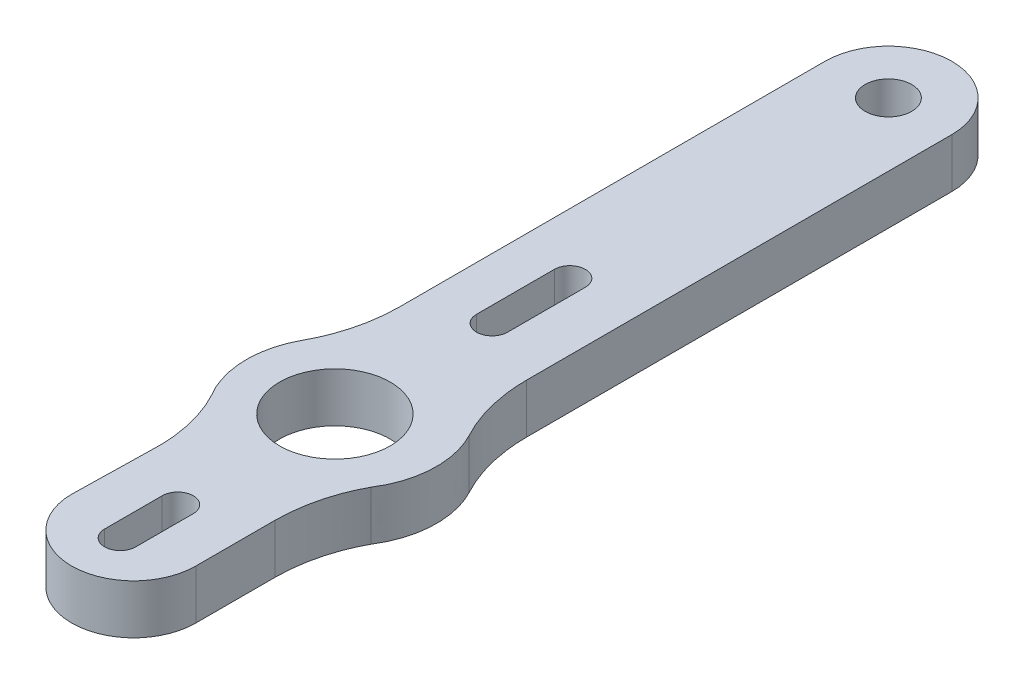
ISO-10303-21;
HEADER;
FILE_DESCRIPTION(('STEP AP214'),'2;1');
FILE_NAME('part.step','',(''),(''),'','','');
FILE_SCHEMA(('AUTOMOTIVE_DESIGN { 1 0 10303 214 1 1 1 1 }'));
ENDSEC;
DATA;
#1=APPLICATION_CONTEXT('core data for automotive mechanical design processes');
#2=APPLICATION_PROTOCOL_DEFINITION('international standard','automotive_design',2000,#1);
#3=PRODUCT_CONTEXT('',#1,'mechanical');
#4=PRODUCT('Part','Part','',(#3));
#5=PRODUCT_RELATED_PRODUCT_CATEGORY('part','',(#4));
#6=PRODUCT_DEFINITION_FORMATION('','',#4);
#7=PRODUCT_DEFINITION_CONTEXT('part definition',#1,'design');
#8=PRODUCT_DEFINITION('design','',#6,#7);
#9=PRODUCT_DEFINITION_SHAPE('','',#8);
#10=(LENGTH_UNIT() NAMED_UNIT(*) SI_UNIT(.MILLI.,.METRE.));
#11=(NAMED_UNIT(*) PLANE_ANGLE_UNIT() SI_UNIT($,.RADIAN.));
#12=(NAMED_UNIT(*) SI_UNIT($,.STERADIAN.) SOLID_ANGLE_UNIT());
#13=UNCERTAINTY_MEASURE_WITH_UNIT(LENGTH_MEASURE(1.E-05),#10,'distance_accuracy_value','');
#14=(GEOMETRIC_REPRESENTATION_CONTEXT(3) GLOBAL_UNCERTAINTY_ASSIGNED_CONTEXT((#13)) GLOBAL_UNIT_ASSIGNED_CONTEXT((#10,
#11,#12)) REPRESENTATION_CONTEXT('',''));
#15=CARTESIAN_POINT('',(0.,0.,0.));
#16=DIRECTION('',(0.,0.,1.));
#17=DIRECTION('',(1.,0.,0.));
#18=AXIS2_PLACEMENT_3D('',#15,#16,#17);
#19=CARTESIAN_POINT('',(-4.16908106055203,3.175,15.9949920017812));
#20=DIRECTION('',(0.,-1.,0.));
#21=DIRECTION('',(0.,0.,-1.));
#22=AXIS2_PLACEMENT_3D('',#19,#20,#21);
#23=PLANE('',#22);
#24=CARTESIAN_POINT('',(0.00104066737557961,3.175,10.9132962446336));
#25=DIRECTION('',(0.,1.,0.));
#26=DIRECTION('',(0.,0.,1.));
#27=AXIS2_PLACEMENT_3D('',#24,#25,#26);
#28=CIRCLE('',#27,3.556);
#29=CARTESIAN_POINT('',(0.00104066737557961,3.175,14.4692962446336));
#30=VERTEX_POINT('',#29);
#31=EDGE_CURVE('E207',#30,#30,#28,.T.);
#32=ORIENTED_EDGE('',*,*,#31,.F.);
#33=EDGE_LOOP('',(#32));
#34=FACE_BOUND('',#33,.T.);
#35=CARTESIAN_POINT('',(0.00106991381050581,3.175,0.813017652380107));
#36=DIRECTION('',(0.,1.,0.));
#37=DIRECTION('',(0.,0.,-1.));
#38=AXIS2_PLACEMENT_3D('',#35,#36,#37);
#39=CIRCLE('',#38,0.998231383477141);
#40=CARTESIAN_POINT('',(-0.997161469666635,3.175,0.813017652380107));
#41=VERTEX_POINT('',#40);
#42=CARTESIAN_POINT('',(0.999301297287647,3.175,0.813017652380107));
#43=VERTEX_POINT('',#42);
#44=EDGE_CURVE('E213',#41,#43,#39,.T.);
#45=ORIENTED_EDGE('',*,*,#44,.F.);
#46=DIRECTION('',(0.,0.,1.));
#47=VECTOR('',#46,1.);
#48=CARTESIAN_POINT('',(-0.997161469666635,3.175,-4.18720119916506));
#49=LINE('',#48,#47);
#50=CARTESIAN_POINT('',(-0.997161469666635,3.175,-4.18720119916506));
#51=VERTEX_POINT('',#50);
#52=EDGE_CURVE('E221',#51,#41,#49,.T.);
#53=ORIENTED_EDGE('',*,*,#52,.F.);
#54=CARTESIAN_POINT('',(0.00106991381050581,3.175,-4.18720119916506));
#55=DIRECTION('',(0.,1.,0.));
#56=DIRECTION('',(0.,0.,-1.));
#57=AXIS2_PLACEMENT_3D('',#54,#55,#56);
#58=CIRCLE('',#57,0.998231383477141);
#59=CARTESIAN_POINT('',(0.999301297287647,3.175,-4.18720119916506));
#60=VERTEX_POINT('',#59);
#61=EDGE_CURVE('E218',#60,#51,#58,.T.);
#62=ORIENTED_EDGE('',*,*,#61,.F.);
#63=DIRECTION('',(0.,0.,-1.));
#64=VECTOR('',#63,1.);
#65=CARTESIAN_POINT('',(0.999301297287647,3.175,0.813017652380107));
#66=LINE('',#65,#64);
#67=EDGE_CURVE('E215',#43,#60,#66,.T.);
#68=ORIENTED_EDGE('',*,*,#67,.F.);
#69=EDGE_LOOP('',(#45,#53,#62,#68));
#70=FACE_BOUND('',#69,.T.);
#71=CARTESIAN_POINT('',(-5.01632488886748,3.175,13.8183221379926));
#72=CARTESIAN_POINT('',(-4.27138671891038,3.175,15.1671684650016));
#73=CARTESIAN_POINT('',(-3.8805408597044,3.175,16.7746802356492));
#74=CARTESIAN_POINT('',(-3.8805408597044,3.175,18.3160677743046));
#75=B_SPLINE_CURVE_WITH_KNOTS('',3,(#71,#72,#73,#74),.UNSPECIFIED.,.F.,.F.,(4,4),(17.,18.),.UNSPECIFIED.);
#76=CARTESIAN_POINT('',(-5.01632488886748,3.175,13.8183221379926));
#77=VERTEX_POINT('',#76);
#78=CARTESIAN_POINT('',(-3.8805408597044,3.175,18.3160677743046));
#79=VERTEX_POINT('',#78);
#80=EDGE_CURVE('E249',#77,#79,#75,.T.);
#81=ORIENTED_EDGE('',*,*,#80,.T.);
#82=DIRECTION('',(-0.0201380543596992,0.,0.999797208821172));
#83=VECTOR('',#82,1.);
#84=CARTESIAN_POINT('',(-3.9918751177016,3.175,23.8434975052788));
#85=LINE('',#84,#83);
#86=CARTESIAN_POINT('',(-3.9918751177016,3.175,23.8434975052788));
#87=VERTEX_POINT('',#86);
#88=EDGE_CURVE('E255',#79,#87,#85,.T.);
#89=ORIENTED_EDGE('',*,*,#88,.T.);
#90=CARTESIAN_POINT('',(0.00106991313382748,3.175,23.8434975052788));
#91=DIRECTION('',(0.,1.,0.));
#92=DIRECTION('',(0.,0.,-1.));
#93=AXIS2_PLACEMENT_3D('',#90,#91,#92);
#94=CIRCLE('',#93,3.99294503083543);
#95=CARTESIAN_POINT('',(3.99401494396925,3.175,23.8434975052788));
#96=VERTEX_POINT('',#95);
#97=EDGE_CURVE('E261',#87,#96,#94,.T.);
#98=ORIENTED_EDGE('',*,*,#97,.T.);
#99=DIRECTION('',(0.,0.,-1.));
#100=VECTOR('',#99,1.);
#101=CARTESIAN_POINT('',(3.99401494396925,3.175,18.7597185620705));
#102=LINE('',#101,#100);
#103=CARTESIAN_POINT('',(3.99401494396925,3.175,18.7597185620705));
#104=VERTEX_POINT('',#103);
#105=EDGE_CURVE('E263',#96,#104,#102,.T.);
#106=ORIENTED_EDGE('',*,*,#105,.T.);
#107=CARTESIAN_POINT('',(3.99401494396925,3.175,18.7597185620705));
#108=CARTESIAN_POINT('',(3.99401494404401,3.175,17.0662909012822));
#109=CARTESIAN_POINT('',(4.42341324434701,3.175,15.3002166148642));
#110=CARTESIAN_POINT('',(5.24176274182083,3.175,13.8183221379926));
#111=B_SPLINE_CURVE_WITH_KNOTS('',3,(#107,#108,#109,#110),.UNSPECIFIED.,.F.,.F.,(4,4),(11.,12.),.UNSPECIFIED.);
#112=CARTESIAN_POINT('',(5.24176274182083,3.175,13.8183221379926));
#113=VERTEX_POINT('',#112);
#114=EDGE_CURVE('E265',#104,#113,#111,.T.);
#115=ORIENTED_EDGE('',*,*,#114,.T.);
#116=CARTESIAN_POINT('',(5.24176274182083,3.175,13.8183221379926));
#117=CARTESIAN_POINT('',(6.37392492293468,3.175,12.0533043274419));
#118=CARTESIAN_POINT('',(6.5298845256268,3.175,9.76643510192553));
#119=CARTESIAN_POINT('',(5.52292472318315,3.175,7.81618794224595));
#120=B_SPLINE_CURVE_WITH_KNOTS('',3,(#116,#117,#118,#119),.UNSPECIFIED.,.F.,.F.,(4,4),(9.,10.),.UNSPECIFIED.);
#121=CARTESIAN_POINT('',(5.52292472318315,3.175,7.81618794224595));
#122=VERTEX_POINT('',#121);
#123=EDGE_CURVE('E270',#113,#122,#120,.T.);
#124=ORIENTED_EDGE('',*,*,#123,.T.);
#125=CARTESIAN_POINT('',(5.52292472318315,3.175,7.81618794224595));
#126=CARTESIAN_POINT('',(4.70457522584158,3.175,6.33422998434839));
#127=CARTESIAN_POINT('',(4.27517692569758,3.175,4.56821917884142));
#128=CARTESIAN_POINT('',(4.27517692577307,3.175,2.8747280371003));
#129=B_SPLINE_CURVE_WITH_KNOTS('',3,(#125,#126,#127,#128),.UNSPECIFIED.,.F.,.F.,(4,4),(8.,9.),.UNSPECIFIED.);
#130=CARTESIAN_POINT('',(4.27517692577307,3.175,2.8747280371003));
#131=VERTEX_POINT('',#130);
#132=EDGE_CURVE('E469',#122,#131,#129,.T.);
#133=ORIENTED_EDGE('',*,*,#132,.T.);
#134=DIRECTION('',(0.,0.,-1.));
#135=VECTOR('',#134,1.);
#136=CARTESIAN_POINT('',(4.27517692577307,3.175,-24.4794195778738));
#137=LINE('',#136,#135);
#138=CARTESIAN_POINT('',(4.27517692577307,3.175,-24.4794195778738));
#139=VERTEX_POINT('',#138);
#140=EDGE_CURVE('E464',#131,#139,#137,.T.);
#141=ORIENTED_EDGE('',*,*,#140,.T.);
#142=CARTESIAN_POINT('',(0.197318033034327,3.175,-24.4630373756859));
#143=DIRECTION('',(0.,1.,0.));
#144=DIRECTION('',(0.,0.,1.));
#145=AXIS2_PLACEMENT_3D('',#142,#143,#144);
#146=CIRCLE('',#145,4.07789179915761);
#147=CARTESIAN_POINT('',(-3.88054085970441,3.175,-24.4466551734979));
#148=VERTEX_POINT('',#147);
#149=EDGE_CURVE('E460',#139,#148,#146,.T.);
#150=ORIENTED_EDGE('',*,*,#149,.T.);
#151=DIRECTION('',(0.,0.,1.));
#152=VECTOR('',#151,1.);
#153=CARTESIAN_POINT('',(-3.88054085970441,3.175,-24.4466551734979));
#154=LINE('',#153,#152);
#155=CARTESIAN_POINT('',(-3.88054085970441,3.175,2.87423818270168));
#156=VERTEX_POINT('',#155);
#157=EDGE_CURVE('E451',#148,#156,#154,.T.);
#158=ORIENTED_EDGE('',*,*,#157,.T.);
#159=CARTESIAN_POINT('',(-3.88054085970441,3.175,2.87423818270168));
#160=CARTESIAN_POINT('',(-3.87987552925061,3.175,4.56772919374628));
#161=CARTESIAN_POINT('',(-4.30857997471308,3.175,6.33390856282873));
#162=CARTESIAN_POINT('',(-5.12641542509204,3.175,7.81618794224595));
#163=B_SPLINE_CURVE_WITH_KNOTS('',3,(#159,#160,#161,#162),.UNSPECIFIED.,.F.,.F.,(4,4),(2.,3.),.UNSPECIFIED.);
#164=CARTESIAN_POINT('',(-5.12641542509204,3.175,7.81618794224595));
#165=VERTEX_POINT('',#164);
#166=EDGE_CURVE('E329',#156,#165,#163,.T.);
#167=ORIENTED_EDGE('',*,*,#166,.T.);
#168=CARTESIAN_POINT('',(-5.12641542509204,3.175,7.81618794224595));
#169=CARTESIAN_POINT('',(-6.18649366447637,3.175,9.73551085026569));
#170=CARTESIAN_POINT('',(-6.09564359098047,3.175,12.0230732710247));
#171=CARTESIAN_POINT('',(-5.01632488886748,3.175,13.8183221379926));
#172=B_SPLINE_CURVE_WITH_KNOTS('',3,(#168,#169,#170,#171),.UNSPECIFIED.,.F.,.F.,(4,4),
(1.00565880697643,2.),.UNSPECIFIED.);
#173=EDGE_CURVE('E323',#165,#77,#172,.T.);
#174=ORIENTED_EDGE('',*,*,#173,.T.);
#175=EDGE_LOOP('',(#81,#89,#98,#106,#115,#124,#133,#141,#150,#158,#167,#174));
#176=FACE_BOUND('',#175,.T.);
#177=CARTESIAN_POINT('',(0.197318033034327,3.175,-24.4630373756859));
#178=DIRECTION('',(0.,1.,0.));
#179=DIRECTION('',(0.,0.,1.));
#180=AXIS2_PLACEMENT_3D('',#177,#178,#179);
#181=CIRCLE('',#180,1.4986);
#182=CARTESIAN_POINT('',(0.197318033034327,3.175,-22.9644373756859));
#183=VERTEX_POINT('',#182);
#184=EDGE_CURVE('E244',#183,#183,#181,.T.);
#185=ORIENTED_EDGE('',*,*,#184,.F.);
#186=EDGE_LOOP('',(#185));
#187=FACE_BOUND('',#186,.T.);
#188=CARTESIAN_POINT('',(0.00106991253301218,3.175,24.7136744780451));
#189=DIRECTION('',(0.,1.,0.));
#190=DIRECTION('',(0.,0.,1.));
#191=AXIS2_PLACEMENT_3D('',#188,#189,#190);
#192=CIRCLE('',#191,0.998231383459032);
#193=CARTESIAN_POINT('',(-0.99716147092602,3.175,24.7136744780451));
#194=VERTEX_POINT('',#193);
#195=CARTESIAN_POINT('',(0.999301295992044,3.175,24.7136744780451));
#196=VERTEX_POINT('',#195);
#197=EDGE_CURVE('E171',#194,#196,#192,.T.);
#198=ORIENTED_EDGE('',*,*,#197,.F.);
#199=DIRECTION('',(0.,0.,1.));
#200=VECTOR('',#199,1.);
#201=CARTESIAN_POINT('',(-0.99716147092602,3.175,24.7136744780451));
#202=LINE('',#201,#200);
#203=CARTESIAN_POINT('',(-0.99716147092602,3.175,21.013579720048));
#204=VERTEX_POINT('',#203);
#205=EDGE_CURVE('E193',#204,#194,#202,.T.);
#206=ORIENTED_EDGE('',*,*,#205,.F.);
#207=CARTESIAN_POINT('',(0.00106991253301207,3.175,21.013579720048));
#208=DIRECTION('',(0.,1.,0.));
#209=DIRECTION('',(0.,0.,-1.));
#210=AXIS2_PLACEMENT_3D('',#207,#208,#209);
#211=CIRCLE('',#210,0.998231383459032);
#212=CARTESIAN_POINT('',(0.999301295992044,3.175,21.013579720048));
#213=VERTEX_POINT('',#212);
#214=EDGE_CURVE('E191',#213,#204,#211,.T.);
#215=ORIENTED_EDGE('',*,*,#214,.F.);
#216=DIRECTION('',(0.,0.,-1.));
#217=VECTOR('',#216,1.);
#218=CARTESIAN_POINT('',(0.999301295992044,3.175,24.7136744780451));
#219=LINE('',#218,#217);
#220=EDGE_CURVE('E179',#196,#213,#219,.T.);
#221=ORIENTED_EDGE('',*,*,#220,.F.);
#222=EDGE_LOOP('',(#198,#206,#215,#221));
#223=FACE_BOUND('',#222,.T.);
#224=ADVANCED_FACE('F33',(#34,#70,#176,#187,#223),#23,.F.);
#225=CARTESIAN_POINT('',(-4.16908106055203,0.,15.9949920017812));
#226=DIRECTION('',(0.,-1.,0.));
#227=DIRECTION('',(0.,0.,-1.));
#228=AXIS2_PLACEMENT_3D('',#225,#226,#227);
#229=PLANE('',#228);
#230=DIRECTION('',(0.,0.,1.));
#231=VECTOR('',#230,1.);
#232=CARTESIAN_POINT('',(-0.997161469666635,0.,-4.18720119916506));
#233=LINE('',#232,#231);
#234=CARTESIAN_POINT('',(-0.997161469666635,0.,-4.18720119916506));
#235=VERTEX_POINT('',#234);
#236=CARTESIAN_POINT('',(-0.997161469666635,0.,0.813017652380107));
#237=VERTEX_POINT('',#236);
#238=EDGE_CURVE('E216',#235,#237,#233,.T.);
#239=ORIENTED_EDGE('',*,*,#238,.T.);
#240=CARTESIAN_POINT('',(0.00106991381050581,0.,0.813017652380107));
#241=DIRECTION('',(0.,1.,0.));
#242=DIRECTION('',(0.,0.,-1.));
#243=AXIS2_PLACEMENT_3D('',#240,#241,#242);
#244=CIRCLE('',#243,0.998231383477141);
#245=CARTESIAN_POINT('',(0.999301297287647,0.,0.813017652380107));
#246=VERTEX_POINT('',#245);
#247=EDGE_CURVE('E210',#237,#246,#244,.T.);
#248=ORIENTED_EDGE('',*,*,#247,.T.);
#249=DIRECTION('',(0.,0.,-1.));
#250=VECTOR('',#249,1.);
#251=CARTESIAN_POINT('',(0.999301297287647,0.,0.813017652380107));
#252=LINE('',#251,#250);
#253=CARTESIAN_POINT('',(0.999301297287647,0.,-4.18720119916506));
#254=VERTEX_POINT('',#253);
#255=EDGE_CURVE('E226',#246,#254,#252,.T.);
#256=ORIENTED_EDGE('',*,*,#255,.T.);
#257=CARTESIAN_POINT('',(0.00106991381050581,0.,-4.18720119916506));
#258=DIRECTION('',(0.,1.,0.));
#259=DIRECTION('',(0.,0.,-1.));
#260=AXIS2_PLACEMENT_3D('',#257,#258,#259);
#261=CIRCLE('',#260,0.998231383477141);
#262=EDGE_CURVE('E229',#254,#235,#261,.T.);
#263=ORIENTED_EDGE('',*,*,#262,.T.);
#264=EDGE_LOOP('',(#239,#248,#256,#263));
#265=FACE_BOUND('',#264,.T.);
#266=CARTESIAN_POINT('',(0.197318033034327,0.,-24.4630373756859));
#267=DIRECTION('',(0.,1.,0.));
#268=DIRECTION('',(0.,0.,1.));
#269=AXIS2_PLACEMENT_3D('',#266,#267,#268);
#270=CIRCLE('',#269,1.4986);
#271=CARTESIAN_POINT('',(0.197318033034327,0.,-22.9644373756859));
#272=VERTEX_POINT('',#271);
#273=EDGE_CURVE('E243',#272,#272,#270,.T.);
#274=ORIENTED_EDGE('',*,*,#273,.T.);
#275=EDGE_LOOP('',(#274));
#276=FACE_BOUND('',#275,.T.);
#277=CARTESIAN_POINT('',(-5.01632488886748,0.,13.8183221379926));
#278=CARTESIAN_POINT('',(-4.27138671891038,0.,15.1671684650016));
#279=CARTESIAN_POINT('',(-3.8805408597044,0.,16.7746802356492));
#280=CARTESIAN_POINT('',(-3.8805408597044,0.,18.3160677743046));
#281=B_SPLINE_CURVE_WITH_KNOTS('',3,(#277,#278,#279,#280),.UNSPECIFIED.,.F.,.F.,(4,4),(17.,18.),.UNSPECIFIED.);
#282=CARTESIAN_POINT('',(-5.01632488886748,0.,13.8183221379926));
#283=VERTEX_POINT('',#282);
#284=CARTESIAN_POINT('',(-3.8805408597044,0.,18.3160677743046));
#285=VERTEX_POINT('',#284);
#286=EDGE_CURVE('E247',#283,#285,#281,.T.);
#287=ORIENTED_EDGE('',*,*,#286,.F.);
#288=CARTESIAN_POINT('',(-5.12641542509204,0.,7.81618794224595));
#289=CARTESIAN_POINT('',(-6.18649366447637,0.,9.73551085026569));
#290=CARTESIAN_POINT('',(-6.09564359098047,0.,12.0230732710247));
#291=CARTESIAN_POINT('',(-5.01632488886748,0.,13.8183221379926));
#292=B_SPLINE_CURVE_WITH_KNOTS('',3,(#288,#289,#290,#291),.UNSPECIFIED.,.F.,.F.,(4,4),
(1.00565880697643,2.),.UNSPECIFIED.);
#293=CARTESIAN_POINT('',(-5.12641542509204,0.,7.81618794224595));
#294=VERTEX_POINT('',#293);
#295=EDGE_CURVE('E256',#294,#283,#292,.T.);
#296=ORIENTED_EDGE('',*,*,#295,.F.);
#297=CARTESIAN_POINT('',(-3.88054085970441,0.,2.87423818270168));
#298=CARTESIAN_POINT('',(-3.87987552925061,0.,4.56772919374628));
#299=CARTESIAN_POINT('',(-4.30857997471308,0.,6.33390856282873));
#300=CARTESIAN_POINT('',(-5.12641542509204,0.,7.81618794224595));
#301=B_SPLINE_CURVE_WITH_KNOTS('',3,(#297,#298,#299,#300),.UNSPECIFIED.,.F.,.F.,(4,4),(2.,3.),.UNSPECIFIED.);
#302=CARTESIAN_POINT('',(-3.88054085970441,0.,2.87423818270168));
#303=VERTEX_POINT('',#302);
#304=EDGE_CURVE('E377',#303,#294,#301,.T.);
#305=ORIENTED_EDGE('',*,*,#304,.F.);
#306=DIRECTION('',(0.,0.,1.));
#307=VECTOR('',#306,1.);
#308=CARTESIAN_POINT('',(-3.88054085970441,0.,-24.4466551734979));
#309=LINE('',#308,#307);
#310=CARTESIAN_POINT('',(-3.88054085970441,0.,-24.4466551734979));
#311=VERTEX_POINT('',#310);
#312=EDGE_CURVE('E375',#311,#303,#309,.T.);
#313=ORIENTED_EDGE('',*,*,#312,.F.);
#314=CARTESIAN_POINT('',(0.197318033034327,0.,-24.4630373756859));
#315=DIRECTION('',(0.,1.,0.));
#316=DIRECTION('',(0.,0.,1.));
#317=AXIS2_PLACEMENT_3D('',#314,#315,#316);
#318=CIRCLE('',#317,4.07789179915761);
#319=CARTESIAN_POINT('',(4.27517692577307,0.,-24.4794195778738));
#320=VERTEX_POINT('',#319);
#321=EDGE_CURVE('E373',#320,#311,#318,.T.);
#322=ORIENTED_EDGE('',*,*,#321,.F.);
#323=DIRECTION('',(0.,0.,-1.));
#324=VECTOR('',#323,1.);
#325=CARTESIAN_POINT('',(4.27517692577307,0.,-24.4794195778738));
#326=LINE('',#325,#324);
#327=CARTESIAN_POINT('',(4.27517692577307,0.,2.8747280371003));
#328=VERTEX_POINT('',#327);
#329=EDGE_CURVE('E368',#328,#320,#326,.T.);
#330=ORIENTED_EDGE('',*,*,#329,.F.);
#331=CARTESIAN_POINT('',(5.52292472318315,0.,7.81618794224595));
#332=CARTESIAN_POINT('',(4.70457522584158,0.,6.33422998434839));
#333=CARTESIAN_POINT('',(4.27517692569758,0.,4.56821917884142));
#334=CARTESIAN_POINT('',(4.27517692577307,0.,2.8747280371003));
#335=B_SPLINE_CURVE_WITH_KNOTS('',3,(#331,#332,#333,#334),.UNSPECIFIED.,.F.,.F.,(4,4),(8.,9.),.UNSPECIFIED.);
#336=CARTESIAN_POINT('',(5.52292472318315,0.,7.81618794224595));
#337=VERTEX_POINT('',#336);
#338=EDGE_CURVE('E361',#337,#328,#335,.T.);
#339=ORIENTED_EDGE('',*,*,#338,.F.);
#340=CARTESIAN_POINT('',(5.24176274182083,0.,13.8183221379926));
#341=CARTESIAN_POINT('',(6.37392492293468,0.,12.0533043274419));
#342=CARTESIAN_POINT('',(6.5298845256268,0.,9.76643510192553));
#343=CARTESIAN_POINT('',(5.52292472318315,0.,7.81618794224595));
#344=B_SPLINE_CURVE_WITH_KNOTS('',3,(#340,#341,#342,#343),.UNSPECIFIED.,.F.,.F.,(4,4),(9.,10.),.UNSPECIFIED.);
#345=CARTESIAN_POINT('',(5.24176274182083,0.,13.8183221379926));
#346=VERTEX_POINT('',#345);
#347=EDGE_CURVE('E354',#346,#337,#344,.T.);
#348=ORIENTED_EDGE('',*,*,#347,.F.);
#349=CARTESIAN_POINT('',(3.99401494396925,0.,18.7597185620705));
#350=CARTESIAN_POINT('',(3.99401494404401,0.,17.0662909012822));
#351=CARTESIAN_POINT('',(4.42341324434701,0.,15.3002166148642));
#352=CARTESIAN_POINT('',(5.24176274182083,0.,13.8183221379926));
#353=B_SPLINE_CURVE_WITH_KNOTS('',3,(#349,#350,#351,#352),.UNSPECIFIED.,.F.,.F.,(4,4),(11.,12.),.UNSPECIFIED.);
#354=CARTESIAN_POINT('',(3.99401494396925,0.,18.7597185620705));
#355=VERTEX_POINT('',#354);
#356=EDGE_CURVE('E350',#355,#346,#353,.T.);
#357=ORIENTED_EDGE('',*,*,#356,.F.);
#358=DIRECTION('',(0.,0.,-1.));
#359=VECTOR('',#358,1.);
#360=CARTESIAN_POINT('',(3.99401494396925,0.,18.7597185620705));
#361=LINE('',#360,#359);
#362=CARTESIAN_POINT('',(3.99401494396925,0.,23.8434975052788));
#363=VERTEX_POINT('',#362);
#364=EDGE_CURVE('E348',#363,#355,#361,.T.);
#365=ORIENTED_EDGE('',*,*,#364,.F.);
#366=CARTESIAN_POINT('',(0.00106991313382748,0.,23.8434975052788));
#367=DIRECTION('',(0.,1.,0.));
#368=DIRECTION('',(0.,0.,-1.));
#369=AXIS2_PLACEMENT_3D('',#366,#367,#368);
#370=CIRCLE('',#369,3.99294503083543);
#371=CARTESIAN_POINT('',(-3.9918751177016,0.,23.8434975052788));
#372=VERTEX_POINT('',#371);
#373=EDGE_CURVE('E346',#372,#363,#370,.T.);
#374=ORIENTED_EDGE('',*,*,#373,.F.);
#375=DIRECTION('',(-0.0201380543596992,0.,0.999797208821172));
#376=VECTOR('',#375,1.);
#377=CARTESIAN_POINT('',(-3.9918751177016,0.,23.8434975052788));
#378=LINE('',#377,#376);
#379=EDGE_CURVE('E341',#285,#372,#378,.T.);
#380=ORIENTED_EDGE('',*,*,#379,.F.);
#381=EDGE_LOOP('',(#287,#296,#305,#313,#322,#330,#339,#348,#357,#365,#374,#380));
#382=FACE_BOUND('',#381,.T.);
#383=CARTESIAN_POINT('',(0.00104066737557961,0.,10.9132962446336));
#384=DIRECTION('',(0.,1.,0.));
#385=DIRECTION('',(0.,0.,1.));
#386=AXIS2_PLACEMENT_3D('',#383,#384,#385);
#387=CIRCLE('',#386,3.556);
#388=CARTESIAN_POINT('',(0.00104066737557961,0.,14.4692962446336));
#389=VERTEX_POINT('',#388);
#390=EDGE_CURVE('E187',#389,#389,#387,.T.);
#391=ORIENTED_EDGE('',*,*,#390,.T.);
#392=EDGE_LOOP('',(#391));
#393=FACE_BOUND('',#392,.T.);
#394=DIRECTION('',(0.,0.,1.));
#395=VECTOR('',#394,1.);
#396=CARTESIAN_POINT('',(-0.99716147092602,0.,24.7136744780451));
#397=LINE('',#396,#395);
#398=CARTESIAN_POINT('',(-0.99716147092602,0.,21.013579720048));
#399=VERTEX_POINT('',#398);
#400=CARTESIAN_POINT('',(-0.99716147092602,0.,24.7136744780451));
#401=VERTEX_POINT('',#400);
#402=EDGE_CURVE('E180',#399,#401,#397,.T.);
#403=ORIENTED_EDGE('',*,*,#402,.T.);
#404=CARTESIAN_POINT('',(0.00106991253301218,0.,24.7136744780451));
#405=DIRECTION('',(0.,1.,0.));
#406=DIRECTION('',(0.,0.,1.));
#407=AXIS2_PLACEMENT_3D('',#404,#405,#406);
#408=CIRCLE('',#407,0.998231383459032);
#409=CARTESIAN_POINT('',(0.999301295992044,0.,24.7136744780451));
#410=VERTEX_POINT('',#409);
#411=EDGE_CURVE('E57',#401,#410,#408,.T.);
#412=ORIENTED_EDGE('',*,*,#411,.T.);
#413=DIRECTION('',(0.,0.,-1.));
#414=VECTOR('',#413,1.);
#415=CARTESIAN_POINT('',(0.999301295992044,0.,24.7136744780451));
#416=LINE('',#415,#414);
#417=CARTESIAN_POINT('',(0.999301295992044,0.,21.013579720048));
#418=VERTEX_POINT('',#417);
#419=EDGE_CURVE('E186',#410,#418,#416,.T.);
#420=ORIENTED_EDGE('',*,*,#419,.T.);
#421=CARTESIAN_POINT('',(0.00106991253301207,0.,21.013579720048));
#422=DIRECTION('',(0.,1.,0.));
#423=DIRECTION('',(0.,0.,-1.));
#424=AXIS2_PLACEMENT_3D('',#421,#422,#423);
#425=CIRCLE('',#424,0.998231383459032);
#426=EDGE_CURVE('E199',#418,#399,#425,.T.);
#427=ORIENTED_EDGE('',*,*,#426,.T.);
#428=EDGE_LOOP('',(#403,#412,#420,#427));
#429=FACE_BOUND('',#428,.T.);
#430=ADVANCED_FACE('F299',(#265,#276,#382,#393,#429),#229,.T.);
#431=DIRECTION('',(0.,-1.,0.));
#432=VECTOR('',#431,1.);
#433=SURFACE_OF_LINEAR_EXTRUSION('',#75,#432);
#434=ORIENTED_EDGE('',*,*,#286,.T.);
#435=DIRECTION('',(0.,-1.,0.));
#436=VECTOR('',#435,1.);
#437=CARTESIAN_POINT('',(-3.8805408597044,3.175,18.3160677743046));
#438=LINE('',#437,#436);
#439=EDGE_CURVE('E11',#79,#285,#438,.T.);
#440=ORIENTED_EDGE('',*,*,#439,.F.);
#441=ORIENTED_EDGE('',*,*,#80,.F.);
#442=DIRECTION('',(0.,-1.,0.));
#443=VECTOR('',#442,1.);
#444=CARTESIAN_POINT('',(-5.01632488886748,3.175,13.8183221379926));
#445=LINE('',#444,#443);
#446=EDGE_CURVE('E328',#77,#283,#445,.T.);
#447=ORIENTED_EDGE('',*,*,#446,.T.);
#448=EDGE_LOOP('',(#434,#440,#441,#447));
#449=FACE_BOUND('',#448,.T.);
#450=ADVANCED_FACE('F35',(#449),#433,.F.);
#451=CARTESIAN_POINT('',(-3.9918751177016,3.175,23.8434975052788));
#452=DIRECTION('',(0.999797208821172,0.,0.0201380543596992));
#453=DIRECTION('',(0.0201380543596992,0.,-0.999797208821172));
#454=AXIS2_PLACEMENT_3D('',#451,#452,#453);
#455=PLANE('',#454);
#456=ORIENTED_EDGE('',*,*,#379,.T.);
#457=DIRECTION('',(0.,-1.,0.));
#458=VECTOR('',#457,1.);
#459=CARTESIAN_POINT('',(-3.9918751177016,3.175,23.8434975052788));
#460=LINE('',#459,#458);
#461=EDGE_CURVE('E42',#87,#372,#460,.T.);
#462=ORIENTED_EDGE('',*,*,#461,.F.);
#463=ORIENTED_EDGE('',*,*,#88,.F.);
#464=ORIENTED_EDGE('',*,*,#439,.T.);
#465=EDGE_LOOP('',(#456,#462,#463,#464));
#466=FACE_BOUND('',#465,.T.);
#467=ADVANCED_FACE('F292',(#466),#455,.F.);
#468=CARTESIAN_POINT('',(0.00106991313382748,3.175,23.8434975052788));
#469=DIRECTION('',(0.,-1.,0.));
#470=DIRECTION('',(0.,0.,-1.));
#471=AXIS2_PLACEMENT_3D('',#468,#469,#470);
#472=CYLINDRICAL_SURFACE('',#471,3.99294503083543);
#473=ORIENTED_EDGE('',*,*,#373,.T.);
#474=DIRECTION('',(0.,-1.,0.));
#475=VECTOR('',#474,1.);
#476=CARTESIAN_POINT('',(3.99401494396925,3.175,23.8434975052788));
#477=LINE('',#476,#475);
#478=EDGE_CURVE('E416',#96,#363,#477,.T.);
#479=ORIENTED_EDGE('',*,*,#478,.F.);
#480=ORIENTED_EDGE('',*,*,#97,.F.);
#481=ORIENTED_EDGE('',*,*,#461,.T.);
#482=EDGE_LOOP('',(#473,#479,#480,#481));
#483=FACE_BOUND('',#482,.T.);
#484=ADVANCED_FACE('F289',(#483),#472,.T.);
#485=CARTESIAN_POINT('',(3.99401494396925,3.175,18.7597185620705));
#486=DIRECTION('',(-1.,0.,0.));
#487=DIRECTION('',(0.,0.,1.));
#488=AXIS2_PLACEMENT_3D('',#485,#486,#487);
#489=PLANE('',#488);
#490=ORIENTED_EDGE('',*,*,#364,.T.);
#491=DIRECTION('',(0.,-1.,0.));
#492=VECTOR('',#491,1.);
#493=CARTESIAN_POINT('',(3.99401494396925,3.175,18.7597185620705));
#494=LINE('',#493,#492);
#495=EDGE_CURVE('E413',#104,#355,#494,.T.);
#496=ORIENTED_EDGE('',*,*,#495,.F.);
#497=ORIENTED_EDGE('',*,*,#105,.F.);
#498=ORIENTED_EDGE('',*,*,#478,.T.);
#499=EDGE_LOOP('',(#490,#496,#497,#498));
#500=FACE_BOUND('',#499,.T.);
#501=ADVANCED_FACE('F284',(#500),#489,.F.);
#502=DIRECTION('',(0.,-1.,0.));
#503=VECTOR('',#502,1.);
#504=SURFACE_OF_LINEAR_EXTRUSION('',#111,#503);
#505=ORIENTED_EDGE('',*,*,#356,.T.);
#506=DIRECTION('',(0.,-1.,0.));
#507=VECTOR('',#506,1.);
#508=CARTESIAN_POINT('',(5.24176274182083,3.175,13.8183221379926));
#509=LINE('',#508,#507);
#510=EDGE_CURVE('E410',#113,#346,#509,.T.);
#511=ORIENTED_EDGE('',*,*,#510,.F.);
#512=ORIENTED_EDGE('',*,*,#114,.F.);
#513=ORIENTED_EDGE('',*,*,#495,.T.);
#514=EDGE_LOOP('',(#505,#511,#512,#513));
#515=FACE_BOUND('',#514,.T.);
#516=ADVANCED_FACE('F279',(#515),#504,.F.);
#517=DIRECTION('',(0.,-1.,0.));
#518=VECTOR('',#517,1.);
#519=SURFACE_OF_LINEAR_EXTRUSION('',#120,#518);
#520=ORIENTED_EDGE('',*,*,#347,.T.);
#521=DIRECTION('',(0.,-1.,0.));
#522=VECTOR('',#521,1.);
#523=CARTESIAN_POINT('',(5.52292472318315,3.175,7.81618794224595));
#524=LINE('',#523,#522);
#525=EDGE_CURVE('E407',#122,#337,#524,.T.);
#526=ORIENTED_EDGE('',*,*,#525,.F.);
#527=ORIENTED_EDGE('',*,*,#123,.F.);
#528=ORIENTED_EDGE('',*,*,#510,.T.);
#529=EDGE_LOOP('',(#520,#526,#527,#528));
#530=FACE_BOUND('',#529,.T.);
#531=ADVANCED_FACE('F283',(#530),#519,.F.);
#532=DIRECTION('',(0.,-1.,0.));
#533=VECTOR('',#532,1.);
#534=SURFACE_OF_LINEAR_EXTRUSION('',#129,#533);
#535=ORIENTED_EDGE('',*,*,#338,.T.);
#536=DIRECTION('',(0.,-1.,0.));
#537=VECTOR('',#536,1.);
#538=CARTESIAN_POINT('',(4.27517692577307,3.175,2.8747280371003));
#539=LINE('',#538,#537);
#540=EDGE_CURVE('E404',#131,#328,#539,.T.);
#541=ORIENTED_EDGE('',*,*,#540,.F.);
#542=ORIENTED_EDGE('',*,*,#132,.F.);
#543=ORIENTED_EDGE('',*,*,#525,.T.);
#544=EDGE_LOOP('',(#535,#541,#542,#543));
#545=FACE_BOUND('',#544,.T.);
#546=ADVANCED_FACE('F468',(#545),#534,.F.);
#547=CARTESIAN_POINT('',(4.27517692577307,3.175,-24.4794195778738));
#548=DIRECTION('',(-1.,0.,0.));
#549=DIRECTION('',(0.,0.,1.));
#550=AXIS2_PLACEMENT_3D('',#547,#548,#549);
#551=PLANE('',#550);
#552=ORIENTED_EDGE('',*,*,#329,.T.);
#553=DIRECTION('',(0.,-1.,0.));
#554=VECTOR('',#553,1.);
#555=CARTESIAN_POINT('',(4.27517692577307,3.175,-24.4794195778738));
#556=LINE('',#555,#554);
#557=EDGE_CURVE('E401',#139,#320,#556,.T.);
#558=ORIENTED_EDGE('',*,*,#557,.F.);
#559=ORIENTED_EDGE('',*,*,#140,.F.);
#560=ORIENTED_EDGE('',*,*,#540,.T.);
#561=EDGE_LOOP('',(#552,#558,#559,#560));
#562=FACE_BOUND('',#561,.T.);
#563=ADVANCED_FACE('F463',(#562),#551,.F.);
#564=CARTESIAN_POINT('',(0.197318033034327,3.175,-24.4630373756859));
#565=DIRECTION('',(0.,-1.,0.));
#566=DIRECTION('',(0.,0.,-1.));
#567=AXIS2_PLACEMENT_3D('',#564,#565,#566);
#568=CYLINDRICAL_SURFACE('',#567,4.07789179915761);
#569=ORIENTED_EDGE('',*,*,#321,.T.);
#570=DIRECTION('',(0.,-1.,0.));
#571=VECTOR('',#570,1.);
#572=CARTESIAN_POINT('',(-3.88054085970441,3.175,-24.4466551734979));
#573=LINE('',#572,#571);
#574=EDGE_CURVE('E398',#148,#311,#573,.T.);
#575=ORIENTED_EDGE('',*,*,#574,.F.);
#576=ORIENTED_EDGE('',*,*,#149,.F.);
#577=ORIENTED_EDGE('',*,*,#557,.T.);
#578=EDGE_LOOP('',(#569,#575,#576,#577));
#579=FACE_BOUND('',#578,.T.);
#580=ADVANCED_FACE('F457',(#579),#568,.T.);
#581=CARTESIAN_POINT('',(-3.88054085970441,3.175,-24.4466551734979));
#582=DIRECTION('',(1.,0.,0.));
#583=DIRECTION('',(0.,0.,-1.));
#584=AXIS2_PLACEMENT_3D('',#581,#582,#583);
#585=PLANE('',#584);
#586=ORIENTED_EDGE('',*,*,#312,.T.);
#587=DIRECTION('',(0.,-1.,0.));
#588=VECTOR('',#587,1.);
#589=CARTESIAN_POINT('',(-3.88054085970441,3.175,2.87423818270168));
#590=LINE('',#589,#588);
#591=EDGE_CURVE('E395',#156,#303,#590,.T.);
#592=ORIENTED_EDGE('',*,*,#591,.F.);
#593=ORIENTED_EDGE('',*,*,#157,.F.);
#594=ORIENTED_EDGE('',*,*,#574,.T.);
#595=EDGE_LOOP('',(#586,#592,#593,#594));
#596=FACE_BOUND('',#595,.T.);
#597=ADVANCED_FACE('F450',(#596),#585,.F.);
#598=DIRECTION('',(0.,-1.,0.));
#599=VECTOR('',#598,1.);
#600=SURFACE_OF_LINEAR_EXTRUSION('',#163,#599);
#601=ORIENTED_EDGE('',*,*,#304,.T.);
#602=DIRECTION('',(0.,-1.,0.));
#603=VECTOR('',#602,1.);
#604=CARTESIAN_POINT('',(-5.12641542509204,3.175,7.81618794224595));
#605=LINE('',#604,#603);
#606=EDGE_CURVE('E392',#165,#294,#605,.T.);
#607=ORIENTED_EDGE('',*,*,#606,.F.);
#608=ORIENTED_EDGE('',*,*,#166,.F.);
#609=ORIENTED_EDGE('',*,*,#591,.T.);
#610=EDGE_LOOP('',(#601,#607,#608,#609));
#611=FACE_BOUND('',#610,.T.);
#612=ADVANCED_FACE('F319',(#611),#600,.F.);
#613=DIRECTION('',(0.,-1.,0.));
#614=VECTOR('',#613,1.);
#615=SURFACE_OF_LINEAR_EXTRUSION('',#172,#614);
#616=ORIENTED_EDGE('',*,*,#295,.T.);
#617=ORIENTED_EDGE('',*,*,#446,.F.);
#618=ORIENTED_EDGE('',*,*,#173,.F.);
#619=ORIENTED_EDGE('',*,*,#606,.T.);
#620=EDGE_LOOP('',(#616,#617,#618,#619));
#621=FACE_BOUND('',#620,.T.);
#622=ADVANCED_FACE('F315',(#621),#615,.F.);
#623=CARTESIAN_POINT('',(0.197318033034327,3.175,-24.4630373756859));
#624=DIRECTION('',(0.,-1.,0.));
#625=DIRECTION('',(0.,0.,-1.));
#626=AXIS2_PLACEMENT_3D('',#623,#624,#625);
#627=CYLINDRICAL_SURFACE('',#626,1.4986);
#628=ORIENTED_EDGE('',*,*,#184,.T.);
#629=EDGE_LOOP('',(#628));
#630=FACE_BOUND('',#629,.T.);
#631=ORIENTED_EDGE('',*,*,#273,.F.);
#632=EDGE_LOOP('',(#631));
#633=FACE_BOUND('',#632,.T.);
#634=ADVANCED_FACE('F312',(#630,#633),#627,.F.);
#635=CARTESIAN_POINT('',(0.00106991381050581,3.175,0.813017652380107));
#636=DIRECTION('',(0.,-1.,0.));
#637=DIRECTION('',(0.,0.,-1.));
#638=AXIS2_PLACEMENT_3D('',#635,#636,#637);
#639=CYLINDRICAL_SURFACE('',#638,0.998231383477141);
#640=ORIENTED_EDGE('',*,*,#247,.F.);
#641=DIRECTION('',(0.,-1.,0.));
#642=VECTOR('',#641,1.);
#643=CARTESIAN_POINT('',(-0.997161469666635,3.175,0.813017652380107));
#644=LINE('',#643,#642);
#645=EDGE_CURVE('E223',#41,#237,#644,.T.);
#646=ORIENTED_EDGE('',*,*,#645,.F.);
#647=ORIENTED_EDGE('',*,*,#44,.T.);
#648=DIRECTION('',(0.,-1.,0.));
#649=VECTOR('',#648,1.);
#650=CARTESIAN_POINT('',(0.999301297287647,3.175,0.813017652380107));
#651=LINE('',#650,#649);
#652=EDGE_CURVE('E240',#43,#246,#651,.T.);
#653=ORIENTED_EDGE('',*,*,#652,.T.);
#654=EDGE_LOOP('',(#640,#646,#647,#653));
#655=FACE_BOUND('',#654,.T.);
#656=ADVANCED_FACE('F500',(#655),#639,.F.);
#657=CARTESIAN_POINT('',(0.999301297287647,3.175,0.813017652380107));
#658=DIRECTION('',(-1.,0.,0.));
#659=DIRECTION('',(0.,0.,1.));
#660=AXIS2_PLACEMENT_3D('',#657,#658,#659);
#661=PLANE('',#660);
#662=ORIENTED_EDGE('',*,*,#255,.F.);
#663=ORIENTED_EDGE('',*,*,#652,.F.);
#664=ORIENTED_EDGE('',*,*,#67,.T.);
#665=DIRECTION('',(0.,-1.,0.));
#666=VECTOR('',#665,1.);
#667=CARTESIAN_POINT('',(0.999301297287647,3.175,-4.18720119916506));
#668=LINE('',#667,#666);
#669=EDGE_CURVE('E238',#60,#254,#668,.T.);
#670=ORIENTED_EDGE('',*,*,#669,.T.);
#671=EDGE_LOOP('',(#662,#663,#664,#670));
#672=FACE_BOUND('',#671,.T.);
#673=ADVANCED_FACE('F507',(#672),#661,.T.);
#674=CARTESIAN_POINT('',(0.00106991381050581,3.175,-4.18720119916506));
#675=DIRECTION('',(0.,-1.,0.));
#676=DIRECTION('',(0.,0.,-1.));
#677=AXIS2_PLACEMENT_3D('',#674,#675,#676);
#678=CYLINDRICAL_SURFACE('',#677,0.998231383477141);
#679=ORIENTED_EDGE('',*,*,#262,.F.);
#680=ORIENTED_EDGE('',*,*,#669,.F.);
#681=ORIENTED_EDGE('',*,*,#61,.T.);
#682=DIRECTION('',(0.,-1.,0.));
#683=VECTOR('',#682,1.);
#684=CARTESIAN_POINT('',(-0.997161469666635,3.175,-4.18720119916506));
#685=LINE('',#684,#683);
#686=EDGE_CURVE('E236',#51,#235,#685,.T.);
#687=ORIENTED_EDGE('',*,*,#686,.T.);
#688=EDGE_LOOP('',(#679,#680,#681,#687));
#689=FACE_BOUND('',#688,.T.);
#690=ADVANCED_FACE('F514',(#689),#678,.F.);
#691=CARTESIAN_POINT('',(-0.997161469666635,3.175,-4.18720119916506));
#692=DIRECTION('',(1.,0.,0.));
#693=DIRECTION('',(0.,0.,-1.));
#694=AXIS2_PLACEMENT_3D('',#691,#692,#693);
#695=PLANE('',#694);
#696=ORIENTED_EDGE('',*,*,#238,.F.);
#697=ORIENTED_EDGE('',*,*,#686,.F.);
#698=ORIENTED_EDGE('',*,*,#52,.T.);
#699=ORIENTED_EDGE('',*,*,#645,.T.);
#700=EDGE_LOOP('',(#696,#697,#698,#699));
#701=FACE_BOUND('',#700,.T.);
#702=ADVANCED_FACE('F522',(#701),#695,.T.);
#703=CARTESIAN_POINT('',(0.00104066737557961,3.175,10.9132962446336));
#704=DIRECTION('',(0.,-1.,0.));
#705=DIRECTION('',(0.,0.,-1.));
#706=AXIS2_PLACEMENT_3D('',#703,#704,#705);
#707=CYLINDRICAL_SURFACE('',#706,3.556);
#708=ORIENTED_EDGE('',*,*,#31,.T.);
#709=EDGE_LOOP('',(#708));
#710=FACE_BOUND('',#709,.T.);
#711=ORIENTED_EDGE('',*,*,#390,.F.);
#712=EDGE_LOOP('',(#711));
#713=FACE_BOUND('',#712,.T.);
#714=ADVANCED_FACE('F530',(#710,#713),#707,.F.);
#715=CARTESIAN_POINT('',(0.00106991253301218,3.175,24.7136744780451));
#716=DIRECTION('',(0.,-1.,0.));
#717=DIRECTION('',(0.,0.,-1.));
#718=AXIS2_PLACEMENT_3D('',#715,#716,#717);
#719=CYLINDRICAL_SURFACE('',#718,0.998231383459032);
#720=ORIENTED_EDGE('',*,*,#411,.F.);
#721=DIRECTION('',(0.,-1.,0.));
#722=VECTOR('',#721,1.);
#723=CARTESIAN_POINT('',(-0.99716147092602,3.175,24.7136744780451));
#724=LINE('',#723,#722);
#725=EDGE_CURVE('E175',#194,#401,#724,.T.);
#726=ORIENTED_EDGE('',*,*,#725,.F.);
#727=ORIENTED_EDGE('',*,*,#197,.T.);
#728=DIRECTION('',(0.,-1.,0.));
#729=VECTOR('',#728,1.);
#730=CARTESIAN_POINT('',(0.999301295992044,3.175,24.7136744780451));
#731=LINE('',#730,#729);
#732=EDGE_CURVE('E174',#196,#410,#731,.T.);
#733=ORIENTED_EDGE('',*,*,#732,.T.);
#734=EDGE_LOOP('',(#720,#726,#727,#733));
#735=FACE_BOUND('',#734,.T.);
#736=ADVANCED_FACE('F173',(#735),#719,.F.);
#737=CARTESIAN_POINT('',(0.999301295992044,3.175,24.7136744780451));
#738=DIRECTION('',(-1.,0.,0.));
#739=DIRECTION('',(0.,0.,1.));
#740=AXIS2_PLACEMENT_3D('',#737,#738,#739);
#741=PLANE('',#740);
#742=ORIENTED_EDGE('',*,*,#419,.F.);
#743=ORIENTED_EDGE('',*,*,#732,.F.);
#744=ORIENTED_EDGE('',*,*,#220,.T.);
#745=DIRECTION('',(0.,-1.,0.));
#746=VECTOR('',#745,1.);
#747=CARTESIAN_POINT('',(0.999301295992044,3.175,21.013579720048));
#748=LINE('',#747,#746);
#749=EDGE_CURVE('E188',#213,#418,#748,.T.);
#750=ORIENTED_EDGE('',*,*,#749,.T.);
#751=EDGE_LOOP('',(#742,#743,#744,#750));
#752=FACE_BOUND('',#751,.T.);
#753=ADVANCED_FACE('F183',(#752),#741,.T.);
#754=CARTESIAN_POINT('',(0.00106991253301207,3.175,21.013579720048));
#755=DIRECTION('',(0.,-1.,0.));
#756=DIRECTION('',(0.,0.,-1.));
#757=AXIS2_PLACEMENT_3D('',#754,#755,#756);
#758=CYLINDRICAL_SURFACE('',#757,0.998231383459032);
#759=ORIENTED_EDGE('',*,*,#426,.F.);
#760=ORIENTED_EDGE('',*,*,#749,.F.);
#761=ORIENTED_EDGE('',*,*,#214,.T.);
#762=DIRECTION('',(0.,-1.,0.));
#763=VECTOR('',#762,1.);
#764=CARTESIAN_POINT('',(-0.99716147092602,3.175,21.013579720048));
#765=LINE('',#764,#763);
#766=EDGE_CURVE('E49',#204,#399,#765,.T.);
#767=ORIENTED_EDGE('',*,*,#766,.T.);
#768=EDGE_LOOP('',(#759,#760,#761,#767));
#769=FACE_BOUND('',#768,.T.);
#770=ADVANCED_FACE('F551',(#769),#758,.F.);
#771=CARTESIAN_POINT('',(-0.99716147092602,3.175,24.7136744780451));
#772=DIRECTION('',(1.,0.,0.));
#773=DIRECTION('',(0.,0.,-1.));
#774=AXIS2_PLACEMENT_3D('',#771,#772,#773);
#775=PLANE('',#774);
#776=ORIENTED_EDGE('',*,*,#402,.F.);
#777=ORIENTED_EDGE('',*,*,#766,.F.);
#778=ORIENTED_EDGE('',*,*,#205,.T.);
#779=ORIENTED_EDGE('',*,*,#725,.T.);
#780=EDGE_LOOP('',(#776,#777,#778,#779));
#781=FACE_BOUND('',#780,.T.);
#782=ADVANCED_FACE('F558',(#781),#775,.T.);
#783=CLOSED_SHELL('',(#224,#430,#450,#467,#484,#501,#516,#531,#546,#563,#580,#597,#612,#622,
#634,#656,#673,#690,#702,#714,#736,#753,#770,#782));
#784=MANIFOLD_SOLID_BREP('B2',#783);
#785=ADVANCED_BREP_SHAPE_REPRESENTATION('',(#18,#784),#14);
#786=SHAPE_DEFINITION_REPRESENTATION(#9,#785);
ENDSEC;
END-ISO-10303-21;
